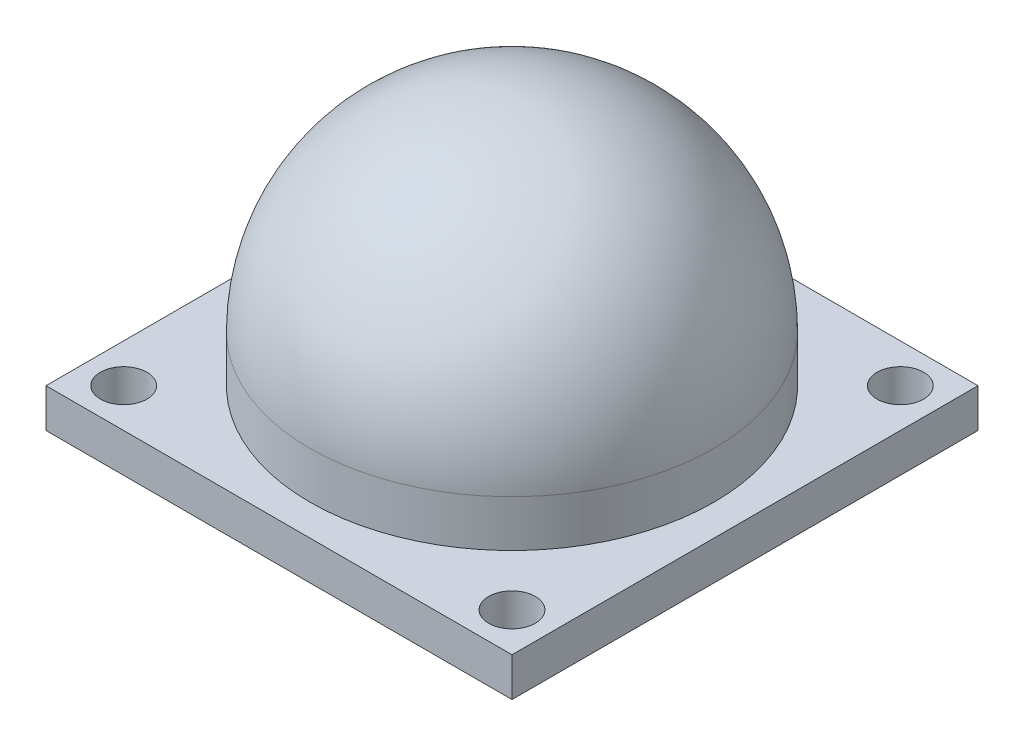
ISO-10303-21;
HEADER;
FILE_DESCRIPTION(('STEP AP214'),'2;1');
FILE_NAME('part.step','',(''),(''),'','','');
FILE_SCHEMA(('AUTOMOTIVE_DESIGN { 1 0 10303 214 1 1 1 1 }'));
ENDSEC;
DATA;
#1=APPLICATION_CONTEXT('core data for automotive mechanical design processes');
#2=APPLICATION_PROTOCOL_DEFINITION('international standard','automotive_design',2000,#1);
#3=PRODUCT_CONTEXT('',#1,'mechanical');
#4=PRODUCT('Part','Part','',(#3));
#5=PRODUCT_RELATED_PRODUCT_CATEGORY('part','',(#4));
#6=PRODUCT_DEFINITION_FORMATION('','',#4);
#7=PRODUCT_DEFINITION_CONTEXT('part definition',#1,'design');
#8=PRODUCT_DEFINITION('design','',#6,#7);
#9=PRODUCT_DEFINITION_SHAPE('','',#8);
#10=(LENGTH_UNIT() NAMED_UNIT(*) SI_UNIT(.MILLI.,.METRE.));
#11=(NAMED_UNIT(*) PLANE_ANGLE_UNIT() SI_UNIT($,.RADIAN.));
#12=(NAMED_UNIT(*) SI_UNIT($,.STERADIAN.) SOLID_ANGLE_UNIT());
#13=UNCERTAINTY_MEASURE_WITH_UNIT(LENGTH_MEASURE(1.E-05),#10,'distance_accuracy_value','');
#14=(GEOMETRIC_REPRESENTATION_CONTEXT(3) GLOBAL_UNCERTAINTY_ASSIGNED_CONTEXT((#13)) GLOBAL_UNIT_ASSIGNED_CONTEXT((#10,
#11,#12)) REPRESENTATION_CONTEXT('',''));
#15=CARTESIAN_POINT('',(0.,0.,0.));
#16=DIRECTION('',(0.,0.,1.));
#17=DIRECTION('',(1.,0.,0.));
#18=AXIS2_PLACEMENT_3D('',#15,#16,#17);
#19=CARTESIAN_POINT('',(0.,2.5,0.));
#20=DIRECTION('',(0.,1.,0.));
#21=DIRECTION('',(0.,0.,1.));
#22=AXIS2_PLACEMENT_3D('',#19,#20,#21);
#23=PLANE('',#22);
#24=CARTESIAN_POINT('',(0.,2.5,0.));
#25=DIRECTION('',(0.,1.,0.));
#26=DIRECTION('',(0.,0.,1.));
#27=AXIS2_PLACEMENT_3D('',#24,#25,#26);
#28=CIRCLE('',#27,13.);
#29=CARTESIAN_POINT('',(0.,2.5,13.));
#30=VERTEX_POINT('',#29);
#31=EDGE_CURVE('E143',#30,#30,#28,.T.);
#32=ORIENTED_EDGE('',*,*,#31,.F.);
#33=EDGE_LOOP('',(#32));
#34=FACE_BOUND('',#33,.T.);
#35=CARTESIAN_POINT('',(-12.5,2.5,12.5));
#36=DIRECTION('',(0.,1.,0.));
#37=DIRECTION('',(0.,0.,1.));
#38=AXIS2_PLACEMENT_3D('',#35,#36,#37);
#39=CIRCLE('',#38,1.5);
#40=CARTESIAN_POINT('',(-12.5,2.5,14.));
#41=VERTEX_POINT('',#40);
#42=EDGE_CURVE('E128',#41,#41,#39,.T.);
#43=ORIENTED_EDGE('',*,*,#42,.F.);
#44=EDGE_LOOP('',(#43));
#45=FACE_BOUND('',#44,.T.);
#46=CARTESIAN_POINT('',(-12.5,2.5,-12.5));
#47=DIRECTION('',(0.,1.,0.));
#48=DIRECTION('',(0.,0.,1.));
#49=AXIS2_PLACEMENT_3D('',#46,#47,#48);
#50=CIRCLE('',#49,1.5);
#51=CARTESIAN_POINT('',(-12.5,2.5,-11.));
#52=VERTEX_POINT('',#51);
#53=EDGE_CURVE('E107',#52,#52,#50,.T.);
#54=ORIENTED_EDGE('',*,*,#53,.F.);
#55=EDGE_LOOP('',(#54));
#56=FACE_BOUND('',#55,.T.);
#57=DIRECTION('',(0.,0.,1.));
#58=VECTOR('',#57,1.);
#59=CARTESIAN_POINT('',(-15.,2.5,15.));
#60=LINE('',#59,#58);
#61=CARTESIAN_POINT('',(-15.,2.5,-15.));
#62=VERTEX_POINT('',#61);
#63=CARTESIAN_POINT('',(-15.,2.5,15.));
#64=VERTEX_POINT('',#63);
#65=EDGE_CURVE('E92',#62,#64,#60,.T.);
#66=ORIENTED_EDGE('',*,*,#65,.T.);
#67=DIRECTION('',(1.,0.,0.));
#68=VECTOR('',#67,1.);
#69=CARTESIAN_POINT('',(15.,2.5,15.));
#70=LINE('',#69,#68);
#71=CARTESIAN_POINT('',(15.,2.5,15.));
#72=VERTEX_POINT('',#71);
#73=EDGE_CURVE('E87',#64,#72,#70,.T.);
#74=ORIENTED_EDGE('',*,*,#73,.T.);
#75=DIRECTION('',(0.,0.,-1.));
#76=VECTOR('',#75,1.);
#77=CARTESIAN_POINT('',(15.,2.5,15.));
#78=LINE('',#77,#76);
#79=CARTESIAN_POINT('',(15.,2.5,-15.));
#80=VERTEX_POINT('',#79);
#81=EDGE_CURVE('E90',#72,#80,#78,.T.);
#82=ORIENTED_EDGE('',*,*,#81,.T.);
#83=DIRECTION('',(-1.,0.,0.));
#84=VECTOR('',#83,1.);
#85=CARTESIAN_POINT('',(15.,2.5,-15.));
#86=LINE('',#85,#84);
#87=EDGE_CURVE('E57',#80,#62,#86,.T.);
#88=ORIENTED_EDGE('',*,*,#87,.T.);
#89=EDGE_LOOP('',(#66,#74,#82,#88));
#90=FACE_BOUND('',#89,.T.);
#91=CARTESIAN_POINT('',(12.5,2.5,-12.5));
#92=DIRECTION('',(0.,1.,0.));
#93=DIRECTION('',(0.,0.,1.));
#94=AXIS2_PLACEMENT_3D('',#91,#92,#93);
#95=CIRCLE('',#94,1.5);
#96=CARTESIAN_POINT('',(12.5,2.5,-11.));
#97=VERTEX_POINT('',#96);
#98=EDGE_CURVE('E122',#97,#97,#95,.T.);
#99=ORIENTED_EDGE('',*,*,#98,.F.);
#100=EDGE_LOOP('',(#99));
#101=FACE_BOUND('',#100,.T.);
#102=CARTESIAN_POINT('',(12.5,2.5,12.5));
#103=DIRECTION('',(0.,1.,0.));
#104=DIRECTION('',(0.,0.,1.));
#105=AXIS2_PLACEMENT_3D('',#102,#103,#104);
#106=CIRCLE('',#105,1.5);
#107=CARTESIAN_POINT('',(12.5,2.5,14.));
#108=VERTEX_POINT('',#107);
#109=EDGE_CURVE('E134',#108,#108,#106,.T.);
#110=ORIENTED_EDGE('',*,*,#109,.F.);
#111=EDGE_LOOP('',(#110));
#112=FACE_BOUND('',#111,.T.);
#113=ADVANCED_FACE('F40',(#34,#45,#56,#90,#101,#112),#23,.T.);
#114=CARTESIAN_POINT('',(0.,0.,0.));
#115=DIRECTION('',(0.,1.,0.));
#116=DIRECTION('',(0.,0.,1.));
#117=AXIS2_PLACEMENT_3D('',#114,#115,#116);
#118=PLANE('',#117);
#119=DIRECTION('',(0.,0.,1.));
#120=VECTOR('',#119,1.);
#121=CARTESIAN_POINT('',(-15.,0.,15.));
#122=LINE('',#121,#120);
#123=CARTESIAN_POINT('',(-15.,0.,-15.));
#124=VERTEX_POINT('',#123);
#125=CARTESIAN_POINT('',(-15.,0.,15.));
#126=VERTEX_POINT('',#125);
#127=EDGE_CURVE('E104',#124,#126,#122,.T.);
#128=ORIENTED_EDGE('',*,*,#127,.F.);
#129=DIRECTION('',(-1.,0.,0.));
#130=VECTOR('',#129,1.);
#131=CARTESIAN_POINT('',(15.,0.,-15.));
#132=LINE('',#131,#130);
#133=CARTESIAN_POINT('',(15.,0.,-15.));
#134=VERTEX_POINT('',#133);
#135=EDGE_CURVE('E80',#134,#124,#132,.T.);
#136=ORIENTED_EDGE('',*,*,#135,.F.);
#137=DIRECTION('',(0.,0.,-1.));
#138=VECTOR('',#137,1.);
#139=CARTESIAN_POINT('',(15.,0.,15.));
#140=LINE('',#139,#138);
#141=CARTESIAN_POINT('',(15.,0.,15.));
#142=VERTEX_POINT('',#141);
#143=EDGE_CURVE('E74',#142,#134,#140,.T.);
#144=ORIENTED_EDGE('',*,*,#143,.F.);
#145=DIRECTION('',(1.,0.,0.));
#146=VECTOR('',#145,1.);
#147=CARTESIAN_POINT('',(15.,0.,15.));
#148=LINE('',#147,#146);
#149=EDGE_CURVE('E96',#126,#142,#148,.T.);
#150=ORIENTED_EDGE('',*,*,#149,.F.);
#151=EDGE_LOOP('',(#128,#136,#144,#150));
#152=FACE_BOUND('',#151,.T.);
#153=CARTESIAN_POINT('',(-12.5,0.,-12.5));
#154=DIRECTION('',(0.,1.,0.));
#155=DIRECTION('',(0.,0.,1.));
#156=AXIS2_PLACEMENT_3D('',#153,#154,#155);
#157=CIRCLE('',#156,1.5);
#158=CARTESIAN_POINT('',(-12.5,0.,-11.));
#159=VERTEX_POINT('',#158);
#160=EDGE_CURVE('E119',#159,#159,#157,.T.);
#161=ORIENTED_EDGE('',*,*,#160,.T.);
#162=EDGE_LOOP('',(#161));
#163=FACE_BOUND('',#162,.T.);
#164=CARTESIAN_POINT('',(12.5,0.,-12.5));
#165=DIRECTION('',(0.,1.,0.));
#166=DIRECTION('',(0.,0.,1.));
#167=AXIS2_PLACEMENT_3D('',#164,#165,#166);
#168=CIRCLE('',#167,1.5);
#169=CARTESIAN_POINT('',(12.5,0.,-11.));
#170=VERTEX_POINT('',#169);
#171=EDGE_CURVE('E125',#170,#170,#168,.T.);
#172=ORIENTED_EDGE('',*,*,#171,.T.);
#173=EDGE_LOOP('',(#172));
#174=FACE_BOUND('',#173,.T.);
#175=CARTESIAN_POINT('',(-12.5,0.,12.5));
#176=DIRECTION('',(0.,1.,0.));
#177=DIRECTION('',(0.,0.,1.));
#178=AXIS2_PLACEMENT_3D('',#175,#176,#177);
#179=CIRCLE('',#178,1.5);
#180=CARTESIAN_POINT('',(-12.5,0.,14.));
#181=VERTEX_POINT('',#180);
#182=EDGE_CURVE('E131',#181,#181,#179,.T.);
#183=ORIENTED_EDGE('',*,*,#182,.T.);
#184=EDGE_LOOP('',(#183));
#185=FACE_BOUND('',#184,.T.);
#186=CARTESIAN_POINT('',(12.5,0.,12.5));
#187=DIRECTION('',(0.,1.,0.));
#188=DIRECTION('',(0.,0.,1.));
#189=AXIS2_PLACEMENT_3D('',#186,#187,#188);
#190=CIRCLE('',#189,1.5);
#191=CARTESIAN_POINT('',(12.5,0.,14.));
#192=VERTEX_POINT('',#191);
#193=EDGE_CURVE('E137',#192,#192,#190,.T.);
#194=ORIENTED_EDGE('',*,*,#193,.T.);
#195=EDGE_LOOP('',(#194));
#196=FACE_BOUND('',#195,.T.);
#197=ADVANCED_FACE('F115',(#152,#163,#174,#185,#196),#118,.F.);
#198=CARTESIAN_POINT('',(-15.,2.5,15.));
#199=DIRECTION('',(1.,0.,0.));
#200=DIRECTION('',(0.,0.,-1.));
#201=AXIS2_PLACEMENT_3D('',#198,#199,#200);
#202=PLANE('',#201);
#203=ORIENTED_EDGE('',*,*,#127,.T.);
#204=DIRECTION('',(0.,-1.,0.));
#205=VECTOR('',#204,1.);
#206=CARTESIAN_POINT('',(-15.,2.5,15.));
#207=LINE('',#206,#205);
#208=EDGE_CURVE('E11',#64,#126,#207,.T.);
#209=ORIENTED_EDGE('',*,*,#208,.F.);
#210=ORIENTED_EDGE('',*,*,#65,.F.);
#211=DIRECTION('',(0.,-1.,0.));
#212=VECTOR('',#211,1.);
#213=CARTESIAN_POINT('',(-15.,2.5,-15.));
#214=LINE('',#213,#212);
#215=EDGE_CURVE('E100',#62,#124,#214,.T.);
#216=ORIENTED_EDGE('',*,*,#215,.T.);
#217=EDGE_LOOP('',(#203,#209,#210,#216));
#218=FACE_BOUND('',#217,.T.);
#219=ADVANCED_FACE('F42',(#218),#202,.F.);
#220=CARTESIAN_POINT('',(15.,2.5,15.));
#221=DIRECTION('',(0.,0.,-1.));
#222=DIRECTION('',(-1.,0.,0.));
#223=AXIS2_PLACEMENT_3D('',#220,#221,#222);
#224=PLANE('',#223);
#225=ORIENTED_EDGE('',*,*,#149,.T.);
#226=DIRECTION('',(0.,-1.,0.));
#227=VECTOR('',#226,1.);
#228=CARTESIAN_POINT('',(15.,2.5,15.));
#229=LINE('',#228,#227);
#230=EDGE_CURVE('E49',#72,#142,#229,.T.);
#231=ORIENTED_EDGE('',*,*,#230,.F.);
#232=ORIENTED_EDGE('',*,*,#73,.F.);
#233=ORIENTED_EDGE('',*,*,#208,.T.);
#234=EDGE_LOOP('',(#225,#231,#232,#233));
#235=FACE_BOUND('',#234,.T.);
#236=ADVANCED_FACE('F95',(#235),#224,.F.);
#237=CARTESIAN_POINT('',(15.,2.5,15.));
#238=DIRECTION('',(-1.,0.,0.));
#239=DIRECTION('',(0.,0.,1.));
#240=AXIS2_PLACEMENT_3D('',#237,#238,#239);
#241=PLANE('',#240);
#242=ORIENTED_EDGE('',*,*,#143,.T.);
#243=DIRECTION('',(0.,-1.,0.));
#244=VECTOR('',#243,1.);
#245=CARTESIAN_POINT('',(15.,2.5,-15.));
#246=LINE('',#245,#244);
#247=EDGE_CURVE('E97',#80,#134,#246,.T.);
#248=ORIENTED_EDGE('',*,*,#247,.F.);
#249=ORIENTED_EDGE('',*,*,#81,.F.);
#250=ORIENTED_EDGE('',*,*,#230,.T.);
#251=EDGE_LOOP('',(#242,#248,#249,#250));
#252=FACE_BOUND('',#251,.T.);
#253=ADVANCED_FACE('F98',(#252),#241,.F.);
#254=CARTESIAN_POINT('',(15.,2.5,-15.));
#255=DIRECTION('',(0.,0.,1.));
#256=DIRECTION('',(1.,0.,0.));
#257=AXIS2_PLACEMENT_3D('',#254,#255,#256);
#258=PLANE('',#257);
#259=ORIENTED_EDGE('',*,*,#135,.T.);
#260=ORIENTED_EDGE('',*,*,#215,.F.);
#261=ORIENTED_EDGE('',*,*,#87,.F.);
#262=ORIENTED_EDGE('',*,*,#247,.T.);
#263=EDGE_LOOP('',(#259,#260,#261,#262));
#264=FACE_BOUND('',#263,.T.);
#265=ADVANCED_FACE('F112',(#264),#258,.F.);
#266=CARTESIAN_POINT('',(-12.5,2.5,-12.5));
#267=DIRECTION('',(0.,-1.,0.));
#268=DIRECTION('',(0.,0.,-1.));
#269=AXIS2_PLACEMENT_3D('',#266,#267,#268);
#270=CYLINDRICAL_SURFACE('',#269,1.5);
#271=ORIENTED_EDGE('',*,*,#53,.T.);
#272=EDGE_LOOP('',(#271));
#273=FACE_BOUND('',#272,.T.);
#274=ORIENTED_EDGE('',*,*,#160,.F.);
#275=EDGE_LOOP('',(#274));
#276=FACE_BOUND('',#275,.T.);
#277=ADVANCED_FACE('F165',(#273,#276),#270,.F.);
#278=CARTESIAN_POINT('',(12.5,2.5,-12.5));
#279=DIRECTION('',(0.,-1.,0.));
#280=DIRECTION('',(0.,0.,-1.));
#281=AXIS2_PLACEMENT_3D('',#278,#279,#280);
#282=CYLINDRICAL_SURFACE('',#281,1.5);
#283=ORIENTED_EDGE('',*,*,#98,.T.);
#284=EDGE_LOOP('',(#283));
#285=FACE_BOUND('',#284,.T.);
#286=ORIENTED_EDGE('',*,*,#171,.F.);
#287=EDGE_LOOP('',(#286));
#288=FACE_BOUND('',#287,.T.);
#289=ADVANCED_FACE('F168',(#285,#288),#282,.F.);
#290=CARTESIAN_POINT('',(-12.5,2.5,12.5));
#291=DIRECTION('',(0.,-1.,0.));
#292=DIRECTION('',(0.,0.,-1.));
#293=AXIS2_PLACEMENT_3D('',#290,#291,#292);
#294=CYLINDRICAL_SURFACE('',#293,1.5);
#295=ORIENTED_EDGE('',*,*,#42,.T.);
#296=EDGE_LOOP('',(#295));
#297=FACE_BOUND('',#296,.T.);
#298=ORIENTED_EDGE('',*,*,#182,.F.);
#299=EDGE_LOOP('',(#298));
#300=FACE_BOUND('',#299,.T.);
#301=ADVANCED_FACE('F181',(#297,#300),#294,.F.);
#302=CARTESIAN_POINT('',(12.5,2.5,12.5));
#303=DIRECTION('',(0.,-1.,0.));
#304=DIRECTION('',(0.,0.,-1.));
#305=AXIS2_PLACEMENT_3D('',#302,#303,#304);
#306=CYLINDRICAL_SURFACE('',#305,1.5);
#307=ORIENTED_EDGE('',*,*,#109,.T.);
#308=EDGE_LOOP('',(#307));
#309=FACE_BOUND('',#308,.T.);
#310=ORIENTED_EDGE('',*,*,#193,.F.);
#311=EDGE_LOOP('',(#310));
#312=FACE_BOUND('',#311,.T.);
#313=ADVANCED_FACE('F154',(#309,#312),#306,.F.);
#314=CARTESIAN_POINT('',(0.,5.5,0.));
#315=DIRECTION('',(0.,-1.,0.));
#316=DIRECTION('',(0.,0.,-1.));
#317=AXIS2_PLACEMENT_3D('',#314,#315,#316);
#318=CYLINDRICAL_SURFACE('',#317,13.);
#319=CARTESIAN_POINT('',(0.,5.5,0.));
#320=DIRECTION('',(0.,1.,0.));
#321=DIRECTION('',(0.,0.,1.));
#322=AXIS2_PLACEMENT_3D('',#319,#320,#321);
#323=CIRCLE('',#322,13.);
#324=CARTESIAN_POINT('',(0.,5.5,13.));
#325=VERTEX_POINT('',#324);
#326=EDGE_CURVE('E140',#325,#325,#323,.T.);
#327=ORIENTED_EDGE('',*,*,#326,.F.);
#328=EDGE_LOOP('',(#327));
#329=FACE_BOUND('',#328,.T.);
#330=ORIENTED_EDGE('',*,*,#31,.T.);
#331=EDGE_LOOP('',(#330));
#332=FACE_BOUND('',#331,.T.);
#333=ADVANCED_FACE('F151',(#329,#332),#318,.T.);
#334=CARTESIAN_POINT('',(0.,5.5,0.));
#335=DIRECTION('',(0.,0.,1.));
#336=DIRECTION('',(1.,0.,0.));
#337=AXIS2_PLACEMENT_3D('',#334,#335,#336);
#338=SPHERICAL_SURFACE('',#337,13.);
#339=CARTESIAN_POINT('',(0.,5.5,0.));
#340=DIRECTION('',(0.,1.,0.));
#341=DIRECTION('',(0.,0.,1.));
#342=AXIS2_PLACEMENT_3D('',#339,#340,#341);
#343=SPHERICAL_SURFACE('',#342,13.);
#344=ORIENTED_EDGE('',*,*,#326,.T.);
#345=EDGE_LOOP('',(#344));
#346=FACE_BOUND('',#345,.T.);
#347=ADVANCED_FACE('F149',(#346),#343,.T.);
#348=CLOSED_SHELL('',(#113,#197,#219,#236,#253,#265,#277,#289,#301,#313,#333,#347));
#349=MANIFOLD_SOLID_BREP('B2',#348);
#350=ADVANCED_BREP_SHAPE_REPRESENTATION('',(#18,#349),#14);
#351=SHAPE_DEFINITION_REPRESENTATION(#9,#350);
ENDSEC;
END-ISO-10303-21;
